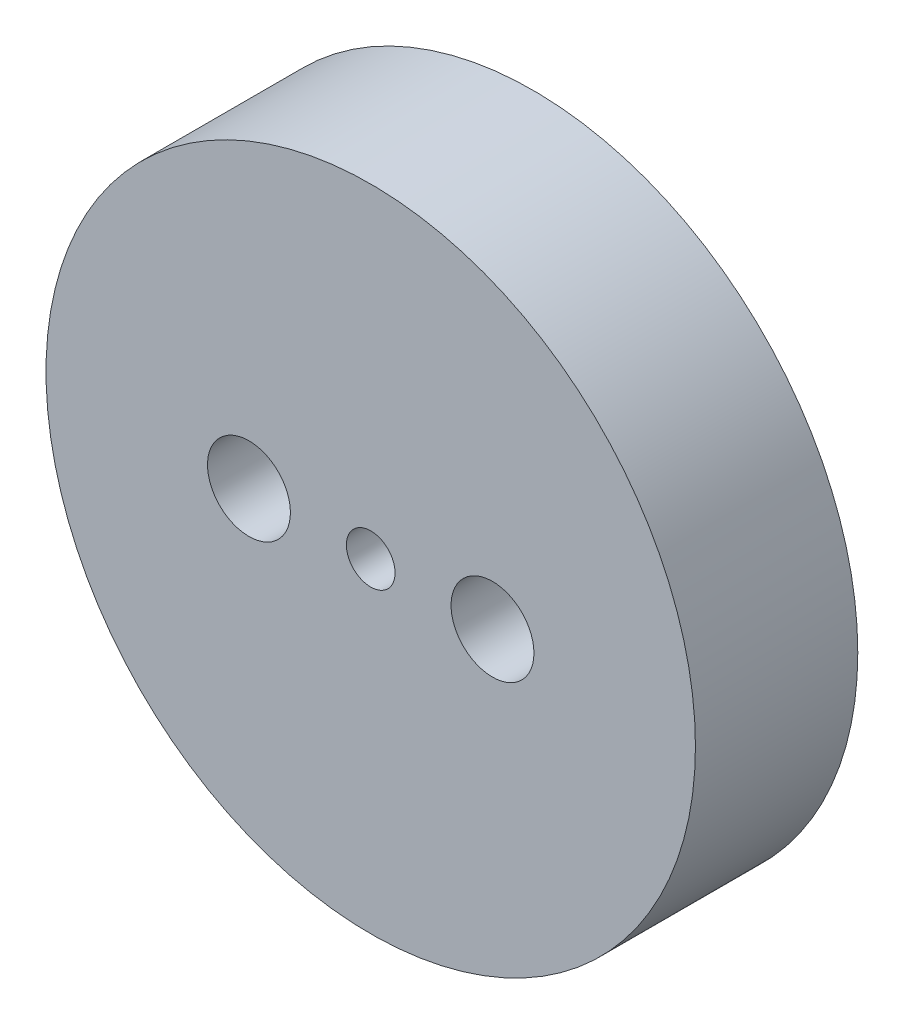
ISO-10303-21;
HEADER;
FILE_DESCRIPTION(('STEP AP214'),'2;1');
FILE_NAME('part.step','',(''),(''),'','','');
FILE_SCHEMA(('AUTOMOTIVE_DESIGN { 1 0 10303 214 1 1 1 1 }'));
ENDSEC;
DATA;
#1=APPLICATION_CONTEXT('core data for automotive mechanical design processes');
#2=APPLICATION_PROTOCOL_DEFINITION('international standard','automotive_design',2000,#1);
#3=PRODUCT_CONTEXT('',#1,'mechanical');
#4=PRODUCT('Part','Part','',(#3));
#5=PRODUCT_RELATED_PRODUCT_CATEGORY('part','',(#4));
#6=PRODUCT_DEFINITION_FORMATION('','',#4);
#7=PRODUCT_DEFINITION_CONTEXT('part definition',#1,'design');
#8=PRODUCT_DEFINITION('design','',#6,#7);
#9=PRODUCT_DEFINITION_SHAPE('','',#8);
#10=(LENGTH_UNIT() NAMED_UNIT(*) SI_UNIT(.MILLI.,.METRE.));
#11=(NAMED_UNIT(*) PLANE_ANGLE_UNIT() SI_UNIT($,.RADIAN.));
#12=(NAMED_UNIT(*) SI_UNIT($,.STERADIAN.) SOLID_ANGLE_UNIT());
#13=UNCERTAINTY_MEASURE_WITH_UNIT(LENGTH_MEASURE(1.E-05),#10,'distance_accuracy_value','');
#14=(GEOMETRIC_REPRESENTATION_CONTEXT(3) GLOBAL_UNCERTAINTY_ASSIGNED_CONTEXT((#13)) GLOBAL_UNIT_ASSIGNED_CONTEXT((#10,
#11,#12)) REPRESENTATION_CONTEXT('',''));
#15=CARTESIAN_POINT('',(0.,0.,0.));
#16=DIRECTION('',(0.,0.,1.));
#17=DIRECTION('',(1.,0.,0.));
#18=AXIS2_PLACEMENT_3D('',#15,#16,#17);
#19=CARTESIAN_POINT('',(0.,0.,10.));
#20=DIRECTION('',(0.,0.,1.));
#21=DIRECTION('',(1.,0.,0.));
#22=AXIS2_PLACEMENT_3D('',#19,#20,#21);
#23=PLANE('',#22);
#24=CARTESIAN_POINT('',(-7.5,0.,10.));
#25=DIRECTION('',(0.,0.,1.));
#26=DIRECTION('',(1.,0.,0.));
#27=AXIS2_PLACEMENT_3D('',#24,#25,#26);
#28=CIRCLE('',#27,2.5527);
#29=CARTESIAN_POINT('',(-4.9473,0.,10.));
#30=VERTEX_POINT('',#29);
#31=EDGE_CURVE('E60',#30,#30,#28,.T.);
#32=ORIENTED_EDGE('',*,*,#31,.F.);
#33=EDGE_LOOP('',(#32));
#34=FACE_BOUND('',#33,.T.);
#35=CARTESIAN_POINT('',(7.5,0.,10.));
#36=DIRECTION('',(0.,0.,1.));
#37=DIRECTION('',(1.,0.,0.));
#38=AXIS2_PLACEMENT_3D('',#35,#36,#37);
#39=CIRCLE('',#38,2.5527);
#40=CARTESIAN_POINT('',(10.0527,0.,10.));
#41=VERTEX_POINT('',#40);
#42=EDGE_CURVE('E54',#41,#41,#39,.T.);
#43=ORIENTED_EDGE('',*,*,#42,.F.);
#44=EDGE_LOOP('',(#43));
#45=FACE_BOUND('',#44,.T.);
#46=CARTESIAN_POINT('',(0.,0.,10.));
#47=DIRECTION('',(0.,0.,1.));
#48=DIRECTION('',(1.,0.,0.));
#49=AXIS2_PLACEMENT_3D('',#46,#47,#48);
#50=CIRCLE('',#49,20.);
#51=CARTESIAN_POINT('',(20.,0.,10.));
#52=VERTEX_POINT('',#51);
#53=EDGE_CURVE('E10',#52,#52,#50,.T.);
#54=ORIENTED_EDGE('',*,*,#53,.T.);
#55=EDGE_LOOP('',(#54));
#56=FACE_BOUND('',#55,.T.);
#57=CARTESIAN_POINT('',(0.,0.,10.));
#58=DIRECTION('',(0.,0.,1.));
#59=DIRECTION('',(1.,0.,0.));
#60=AXIS2_PLACEMENT_3D('',#57,#58,#59);
#61=CIRCLE('',#60,1.5);
#62=CARTESIAN_POINT('',(1.5,0.,10.));
#63=VERTEX_POINT('',#62);
#64=EDGE_CURVE('E44',#63,#63,#61,.T.);
#65=ORIENTED_EDGE('',*,*,#64,.F.);
#66=EDGE_LOOP('',(#65));
#67=FACE_BOUND('',#66,.T.);
#68=ADVANCED_FACE('F33',(#34,#45,#56,#67),#23,.T.);
#69=CARTESIAN_POINT('',(0.,0.,0.));
#70=DIRECTION('',(0.,0.,1.));
#71=DIRECTION('',(1.,0.,0.));
#72=AXIS2_PLACEMENT_3D('',#69,#70,#71);
#73=PLANE('',#72);
#74=CARTESIAN_POINT('',(-7.5,0.,0.));
#75=DIRECTION('',(0.,0.,1.));
#76=DIRECTION('',(1.,0.,0.));
#77=AXIS2_PLACEMENT_3D('',#74,#75,#76);
#78=CIRCLE('',#77,2.5527);
#79=CARTESIAN_POINT('',(-4.9473,0.,0.));
#80=VERTEX_POINT('',#79);
#81=EDGE_CURVE('E57',#80,#80,#78,.T.);
#82=ORIENTED_EDGE('',*,*,#81,.T.);
#83=EDGE_LOOP('',(#82));
#84=FACE_BOUND('',#83,.T.);
#85=CARTESIAN_POINT('',(7.5,0.,0.));
#86=DIRECTION('',(0.,0.,1.));
#87=DIRECTION('',(1.,0.,0.));
#88=AXIS2_PLACEMENT_3D('',#85,#86,#87);
#89=CIRCLE('',#88,2.5527);
#90=CARTESIAN_POINT('',(10.0527,0.,0.));
#91=VERTEX_POINT('',#90);
#92=EDGE_CURVE('E49',#91,#91,#89,.T.);
#93=ORIENTED_EDGE('',*,*,#92,.T.);
#94=EDGE_LOOP('',(#93));
#95=FACE_BOUND('',#94,.T.);
#96=CARTESIAN_POINT('',(0.,0.,0.));
#97=DIRECTION('',(0.,0.,1.));
#98=DIRECTION('',(1.,0.,0.));
#99=AXIS2_PLACEMENT_3D('',#96,#97,#98);
#100=CIRCLE('',#99,20.);
#101=CARTESIAN_POINT('',(20.,0.,0.));
#102=VERTEX_POINT('',#101);
#103=EDGE_CURVE('E37',#102,#102,#100,.T.);
#104=ORIENTED_EDGE('',*,*,#103,.F.);
#105=EDGE_LOOP('',(#104));
#106=FACE_BOUND('',#105,.T.);
#107=CARTESIAN_POINT('',(0.,0.,0.));
#108=DIRECTION('',(0.,0.,1.));
#109=DIRECTION('',(1.,0.,0.));
#110=AXIS2_PLACEMENT_3D('',#107,#108,#109);
#111=CIRCLE('',#110,1.5);
#112=CARTESIAN_POINT('',(1.5,0.,0.));
#113=VERTEX_POINT('',#112);
#114=EDGE_CURVE('E46',#113,#113,#111,.T.);
#115=ORIENTED_EDGE('',*,*,#114,.T.);
#116=EDGE_LOOP('',(#115));
#117=FACE_BOUND('',#116,.T.);
#118=ADVANCED_FACE('F68',(#84,#95,#106,#117),#73,.F.);
#119=CARTESIAN_POINT('',(0.,0.,10.));
#120=DIRECTION('',(0.,0.,-1.));
#121=DIRECTION('',(-1.,0.,0.));
#122=AXIS2_PLACEMENT_3D('',#119,#120,#121);
#123=CYLINDRICAL_SURFACE('',#122,20.);
#124=ORIENTED_EDGE('',*,*,#53,.F.);
#125=EDGE_LOOP('',(#124));
#126=FACE_BOUND('',#125,.T.);
#127=ORIENTED_EDGE('',*,*,#103,.T.);
#128=EDGE_LOOP('',(#127));
#129=FACE_BOUND('',#128,.T.);
#130=ADVANCED_FACE('F35',(#126,#129),#123,.T.);
#131=CARTESIAN_POINT('',(0.,0.,10.));
#132=DIRECTION('',(0.,0.,-1.));
#133=DIRECTION('',(-1.,0.,0.));
#134=AXIS2_PLACEMENT_3D('',#131,#132,#133);
#135=CYLINDRICAL_SURFACE('',#134,1.5);
#136=ORIENTED_EDGE('',*,*,#64,.T.);
#137=EDGE_LOOP('',(#136));
#138=FACE_BOUND('',#137,.T.);
#139=ORIENTED_EDGE('',*,*,#114,.F.);
#140=EDGE_LOOP('',(#139));
#141=FACE_BOUND('',#140,.T.);
#142=ADVANCED_FACE('F74',(#138,#141),#135,.F.);
#143=CARTESIAN_POINT('',(7.5,0.,10.));
#144=DIRECTION('',(0.,0.,1.));
#145=DIRECTION('',(1.,0.,0.));
#146=AXIS2_PLACEMENT_3D('',#143,#144,#145);
#147=CYLINDRICAL_SURFACE('',#146,2.5527);
#148=ORIENTED_EDGE('',*,*,#92,.F.);
#149=EDGE_LOOP('',(#148));
#150=FACE_BOUND('',#149,.T.);
#151=ORIENTED_EDGE('',*,*,#42,.T.);
#152=EDGE_LOOP('',(#151));
#153=FACE_BOUND('',#152,.T.);
#154=ADVANCED_FACE('F77',(#150,#153),#147,.F.);
#155=CARTESIAN_POINT('',(-7.5,0.,10.));
#156=DIRECTION('',(0.,0.,1.));
#157=DIRECTION('',(1.,0.,0.));
#158=AXIS2_PLACEMENT_3D('',#155,#156,#157);
#159=CYLINDRICAL_SURFACE('',#158,2.5527);
#160=ORIENTED_EDGE('',*,*,#81,.F.);
#161=EDGE_LOOP('',(#160));
#162=FACE_BOUND('',#161,.T.);
#163=ORIENTED_EDGE('',*,*,#31,.T.);
#164=EDGE_LOOP('',(#163));
#165=FACE_BOUND('',#164,.T.);
#166=ADVANCED_FACE('F64',(#162,#165),#159,.F.);
#167=CLOSED_SHELL('',(#68,#118,#130,#142,#154,#166));
#168=MANIFOLD_SOLID_BREP('B2',#167);
#169=ADVANCED_BREP_SHAPE_REPRESENTATION('',(#18,#168),#14);
#170=SHAPE_DEFINITION_REPRESENTATION(#9,#169);
ENDSEC;
END-ISO-10303-21;
